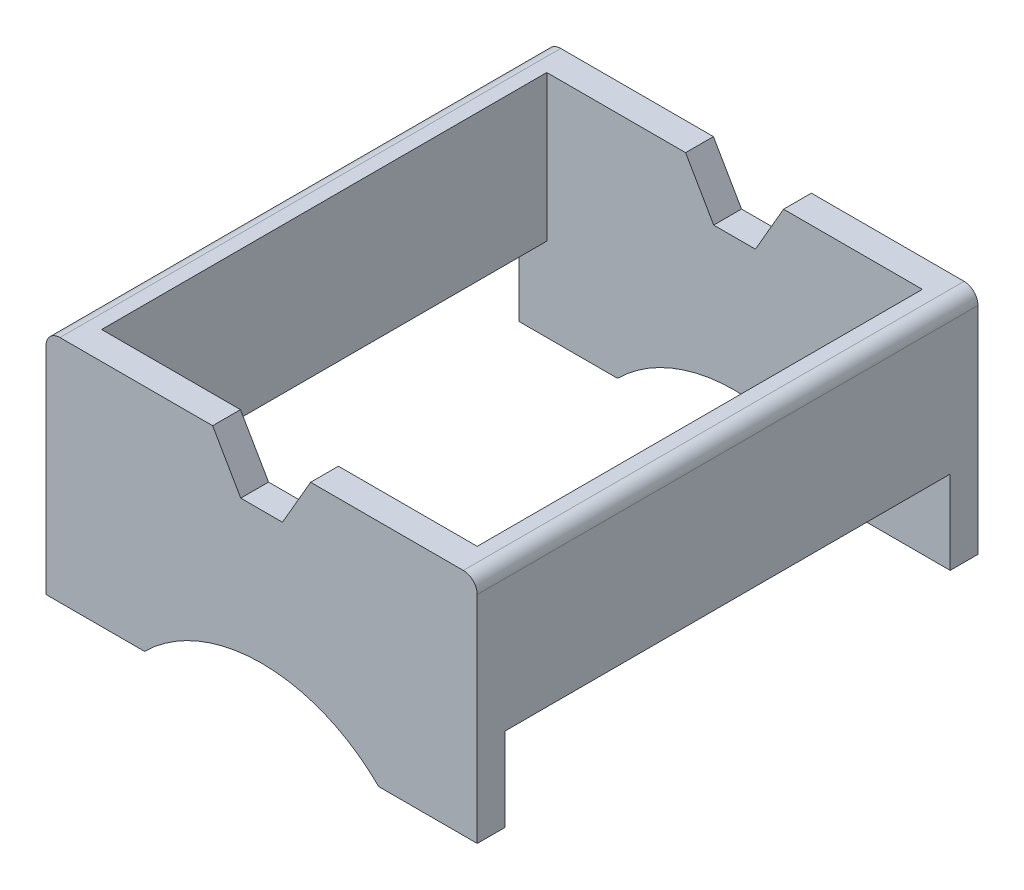
ISO-10303-21;
HEADER;
FILE_DESCRIPTION(('STEP AP214'),'2;1');
FILE_NAME('part.step','',(''),(''),'','','');
FILE_SCHEMA(('AUTOMOTIVE_DESIGN { 1 0 10303 214 1 1 1 1 }'));
ENDSEC;
DATA;
#1=APPLICATION_CONTEXT('core data for automotive mechanical design processes');
#2=APPLICATION_PROTOCOL_DEFINITION('international standard','automotive_design',2000,#1);
#3=PRODUCT_CONTEXT('',#1,'mechanical');
#4=PRODUCT('Part','Part','',(#3));
#5=PRODUCT_RELATED_PRODUCT_CATEGORY('part','',(#4));
#6=PRODUCT_DEFINITION_FORMATION('','',#4);
#7=PRODUCT_DEFINITION_CONTEXT('part definition',#1,'design');
#8=PRODUCT_DEFINITION('design','',#6,#7);
#9=PRODUCT_DEFINITION_SHAPE('','',#8);
#10=(LENGTH_UNIT() NAMED_UNIT(*) SI_UNIT(.MILLI.,.METRE.));
#11=(NAMED_UNIT(*) PLANE_ANGLE_UNIT() SI_UNIT($,.RADIAN.));
#12=(NAMED_UNIT(*) SI_UNIT($,.STERADIAN.) SOLID_ANGLE_UNIT());
#13=UNCERTAINTY_MEASURE_WITH_UNIT(LENGTH_MEASURE(1.E-05),#10,'distance_accuracy_value','');
#14=(GEOMETRIC_REPRESENTATION_CONTEXT(3) GLOBAL_UNCERTAINTY_ASSIGNED_CONTEXT((#13)) GLOBAL_UNIT_ASSIGNED_CONTEXT((#10,
#11,#12)) REPRESENTATION_CONTEXT('',''));
#15=CARTESIAN_POINT('',(0.,0.,0.));
#16=DIRECTION('',(0.,0.,1.));
#17=DIRECTION('',(1.,0.,0.));
#18=AXIS2_PLACEMENT_3D('',#15,#16,#17);
#19=CARTESIAN_POINT('',(-15.5,0.,18.));
#20=DIRECTION('',(0.,1.,0.));
#21=DIRECTION('',(0.,0.,1.));
#22=AXIS2_PLACEMENT_3D('',#19,#20,#21);
#23=PLANE('',#22);
#24=DIRECTION('',(-1.,0.,0.));
#25=VECTOR('',#24,1.);
#26=CARTESIAN_POINT('',(-15.5,0.,-18.));
#27=LINE('',#26,#25);
#28=CARTESIAN_POINT('',(-8.41596001110841,0.,-18.));
#29=VERTEX_POINT('',#28);
#30=CARTESIAN_POINT('',(-15.5,0.,-18.));
#31=VERTEX_POINT('',#30);
#32=EDGE_CURVE('E228',#29,#31,#27,.T.);
#33=ORIENTED_EDGE('',*,*,#32,.F.);
#34=DIRECTION('',(0.,0.,1.));
#35=VECTOR('',#34,1.);
#36=CARTESIAN_POINT('',(-8.41596001110841,0.,-125.864561757798));
#37=LINE('',#36,#35);
#38=CARTESIAN_POINT('',(-8.41596001110841,0.,-16.));
#39=VERTEX_POINT('',#38);
#40=EDGE_CURVE('E227',#29,#39,#37,.T.);
#41=ORIENTED_EDGE('',*,*,#40,.T.);
#42=DIRECTION('',(-1.,0.,0.));
#43=VECTOR('',#42,1.);
#44=CARTESIAN_POINT('',(-13.5,0.,-16.));
#45=LINE('',#44,#43);
#46=CARTESIAN_POINT('',(-15.5,0.,-16.));
#47=VERTEX_POINT('',#46);
#48=EDGE_CURVE('E211',#39,#47,#45,.T.);
#49=ORIENTED_EDGE('',*,*,#48,.T.);
#50=DIRECTION('',(0.,0.,1.));
#51=VECTOR('',#50,1.);
#52=CARTESIAN_POINT('',(-15.5,0.,-18.));
#53=LINE('',#52,#51);
#54=EDGE_CURVE('E340',#31,#47,#53,.T.);
#55=ORIENTED_EDGE('',*,*,#54,.F.);
#56=EDGE_LOOP('',(#33,#41,#49,#55));
#57=FACE_BOUND('',#56,.T.);
#58=ADVANCED_FACE('F37',(#57),#23,.F.);
#59=DIRECTION('',(1.,0.,0.));
#60=VECTOR('',#59,1.);
#61=CARTESIAN_POINT('',(-13.5,0.,16.));
#62=LINE('',#61,#60);
#63=CARTESIAN_POINT('',(-15.5,0.,16.));
#64=VERTEX_POINT('',#63);
#65=CARTESIAN_POINT('',(-8.41596001110841,0.,16.));
#66=VERTEX_POINT('',#65);
#67=EDGE_CURVE('E319',#64,#66,#62,.T.);
#68=ORIENTED_EDGE('',*,*,#67,.T.);
#69=CARTESIAN_POINT('',(-8.41596001110841,0.,18.));
#70=VERTEX_POINT('',#69);
#71=EDGE_CURVE('E60',#66,#70,#37,.T.);
#72=ORIENTED_EDGE('',*,*,#71,.T.);
#73=DIRECTION('',(1.,0.,0.));
#74=VECTOR('',#73,1.);
#75=CARTESIAN_POINT('',(-15.5,0.,18.));
#76=LINE('',#75,#74);
#77=CARTESIAN_POINT('',(-15.5,0.,18.));
#78=VERTEX_POINT('',#77);
#79=EDGE_CURVE('E343',#78,#70,#76,.T.);
#80=ORIENTED_EDGE('',*,*,#79,.F.);
#81=EDGE_CURVE('E332',#64,#78,#53,.T.);
#82=ORIENTED_EDGE('',*,*,#81,.F.);
#83=EDGE_LOOP('',(#68,#72,#80,#82));
#84=FACE_BOUND('',#83,.T.);
#85=ADVANCED_FACE('F490',(#84),#23,.F.);
#86=CARTESIAN_POINT('',(-15.5,16.5,18.));
#87=DIRECTION('',(0.,1.,0.));
#88=DIRECTION('',(0.,0.,1.));
#89=AXIS2_PLACEMENT_3D('',#86,#87,#88);
#90=PLANE('',#89);
#91=DIRECTION('',(1.,0.,0.));
#92=VECTOR('',#91,1.);
#93=CARTESIAN_POINT('',(-15.5,16.5,18.));
#94=LINE('',#93,#92);
#95=CARTESIAN_POINT('',(3.52072594216368,16.5,18.));
#96=VERTEX_POINT('',#95);
#97=CARTESIAN_POINT('',(14.5,16.5,18.));
#98=VERTEX_POINT('',#97);
#99=EDGE_CURVE('E336',#96,#98,#94,.T.);
#100=ORIENTED_EDGE('',*,*,#99,.T.);
#101=DIRECTION('',(0.,0.,-1.));
#102=VECTOR('',#101,1.);
#103=CARTESIAN_POINT('',(14.5,16.5,-18.));
#104=LINE('',#103,#102);
#105=CARTESIAN_POINT('',(14.5,16.5,-18.));
#106=VERTEX_POINT('',#105);
#107=EDGE_CURVE('E370',#98,#106,#104,.T.);
#108=ORIENTED_EDGE('',*,*,#107,.T.);
#109=DIRECTION('',(-1.,0.,0.));
#110=VECTOR('',#109,1.);
#111=CARTESIAN_POINT('',(-15.5,16.5,-18.));
#112=LINE('',#111,#110);
#113=CARTESIAN_POINT('',(3.52072594216368,16.5,-18.));
#114=VERTEX_POINT('',#113);
#115=EDGE_CURVE('E337',#106,#114,#112,.T.);
#116=ORIENTED_EDGE('',*,*,#115,.T.);
#117=DIRECTION('',(0.,0.,-1.));
#118=VECTOR('',#117,1.);
#119=CARTESIAN_POINT('',(3.52072594216368,16.5,18.));
#120=LINE('',#119,#118);
#121=CARTESIAN_POINT('',(3.52072594216368,16.5,-16.));
#122=VERTEX_POINT('',#121);
#123=EDGE_CURVE('E263',#122,#114,#120,.T.);
#124=ORIENTED_EDGE('',*,*,#123,.F.);
#125=DIRECTION('',(-1.,0.,0.));
#126=VECTOR('',#125,1.);
#127=CARTESIAN_POINT('',(-13.5,16.5,-16.));
#128=LINE('',#127,#126);
#129=CARTESIAN_POINT('',(13.5,16.5,-16.));
#130=VERTEX_POINT('',#129);
#131=EDGE_CURVE('E305',#130,#122,#128,.T.);
#132=ORIENTED_EDGE('',*,*,#131,.F.);
#133=DIRECTION('',(0.,0.,-1.));
#134=VECTOR('',#133,1.);
#135=CARTESIAN_POINT('',(13.5,16.5,-16.));
#136=LINE('',#135,#134);
#137=CARTESIAN_POINT('',(13.5,16.5,16.));
#138=VERTEX_POINT('',#137);
#139=EDGE_CURVE('E315',#138,#130,#136,.T.);
#140=ORIENTED_EDGE('',*,*,#139,.F.);
#141=DIRECTION('',(1.,0.,0.));
#142=VECTOR('',#141,1.);
#143=CARTESIAN_POINT('',(-13.5,16.5,16.));
#144=LINE('',#143,#142);
#145=CARTESIAN_POINT('',(3.52072594216368,16.5,16.));
#146=VERTEX_POINT('',#145);
#147=EDGE_CURVE('E311',#146,#138,#144,.T.);
#148=ORIENTED_EDGE('',*,*,#147,.F.);
#149=EDGE_CURVE('E260',#96,#146,#120,.T.);
#150=ORIENTED_EDGE('',*,*,#149,.F.);
#151=EDGE_LOOP('',(#100,#108,#116,#124,#132,#140,#148,#150));
#152=FACE_BOUND('',#151,.T.);
#153=ADVANCED_FACE('F439',(#152),#90,.T.);
#154=CARTESIAN_POINT('',(15.5,0.,-16.));
#155=VERTEX_POINT('',#154);
#156=CARTESIAN_POINT('',(8.41596001110841,0.,-16.));
#157=VERTEX_POINT('',#156);
#158=EDGE_CURVE('E222',#155,#157,#45,.T.);
#159=ORIENTED_EDGE('',*,*,#158,.T.);
#160=DIRECTION('',(0.,0.,1.));
#161=VECTOR('',#160,1.);
#162=CARTESIAN_POINT('',(8.41596001110841,0.,-125.864561757798));
#163=LINE('',#162,#161);
#164=CARTESIAN_POINT('',(8.41596001110841,0.,-18.));
#165=VERTEX_POINT('',#164);
#166=EDGE_CURVE('E234',#165,#157,#163,.T.);
#167=ORIENTED_EDGE('',*,*,#166,.F.);
#168=CARTESIAN_POINT('',(15.5,0.,-18.));
#169=VERTEX_POINT('',#168);
#170=EDGE_CURVE('E349',#169,#165,#27,.T.);
#171=ORIENTED_EDGE('',*,*,#170,.F.);
#172=DIRECTION('',(0.,0.,-1.));
#173=VECTOR('',#172,1.);
#174=CARTESIAN_POINT('',(15.5,0.,-18.));
#175=LINE('',#174,#173);
#176=EDGE_CURVE('E345',#155,#169,#175,.T.);
#177=ORIENTED_EDGE('',*,*,#176,.F.);
#178=EDGE_LOOP('',(#159,#167,#171,#177));
#179=FACE_BOUND('',#178,.T.);
#180=ADVANCED_FACE('F466',(#179),#23,.F.);
#181=CARTESIAN_POINT('',(-3.52072594216368,16.5,-18.));
#182=VERTEX_POINT('',#181);
#183=CARTESIAN_POINT('',(-14.5,16.5,-18.));
#184=VERTEX_POINT('',#183);
#185=EDGE_CURVE('E335',#182,#184,#112,.T.);
#186=ORIENTED_EDGE('',*,*,#185,.T.);
#187=DIRECTION('',(0.,0.,1.));
#188=VECTOR('',#187,1.);
#189=CARTESIAN_POINT('',(-14.5,16.5,18.));
#190=LINE('',#189,#188);
#191=CARTESIAN_POINT('',(-14.5,16.5,18.));
#192=VERTEX_POINT('',#191);
#193=EDGE_CURVE('E383',#184,#192,#190,.T.);
#194=ORIENTED_EDGE('',*,*,#193,.T.);
#195=CARTESIAN_POINT('',(-3.52072594216368,16.5,18.));
#196=VERTEX_POINT('',#195);
#197=EDGE_CURVE('E333',#192,#196,#94,.T.);
#198=ORIENTED_EDGE('',*,*,#197,.T.);
#199=DIRECTION('',(0.,0.,-1.));
#200=VECTOR('',#199,1.);
#201=CARTESIAN_POINT('',(-3.52072594216368,16.5,18.));
#202=LINE('',#201,#200);
#203=CARTESIAN_POINT('',(-3.52072594216368,16.5,16.));
#204=VERTEX_POINT('',#203);
#205=EDGE_CURVE('E264',#196,#204,#202,.T.);
#206=ORIENTED_EDGE('',*,*,#205,.T.);
#207=CARTESIAN_POINT('',(-13.5,16.5,16.));
#208=VERTEX_POINT('',#207);
#209=EDGE_CURVE('E312',#208,#204,#144,.T.);
#210=ORIENTED_EDGE('',*,*,#209,.F.);
#211=DIRECTION('',(0.,0.,1.));
#212=VECTOR('',#211,1.);
#213=CARTESIAN_POINT('',(-13.5,16.5,-16.));
#214=LINE('',#213,#212);
#215=CARTESIAN_POINT('',(-13.5,16.5,-16.));
#216=VERTEX_POINT('',#215);
#217=EDGE_CURVE('E308',#216,#208,#214,.T.);
#218=ORIENTED_EDGE('',*,*,#217,.F.);
#219=CARTESIAN_POINT('',(-3.52072594216368,16.5,-16.));
#220=VERTEX_POINT('',#219);
#221=EDGE_CURVE('E309',#220,#216,#128,.T.);
#222=ORIENTED_EDGE('',*,*,#221,.F.);
#223=EDGE_CURVE('E267',#220,#182,#202,.T.);
#224=ORIENTED_EDGE('',*,*,#223,.T.);
#225=EDGE_LOOP('',(#186,#194,#198,#206,#210,#218,#222,#224));
#226=FACE_BOUND('',#225,.T.);
#227=ADVANCED_FACE('F400',(#226),#90,.T.);
#228=CARTESIAN_POINT('',(8.41596001110841,0.,18.));
#229=VERTEX_POINT('',#228);
#230=CARTESIAN_POINT('',(15.5,0.,18.));
#231=VERTEX_POINT('',#230);
#232=EDGE_CURVE('E342',#229,#231,#76,.T.);
#233=ORIENTED_EDGE('',*,*,#232,.F.);
#234=CARTESIAN_POINT('',(8.41596001110841,0.,15.9999999999999));
#235=VERTEX_POINT('',#234);
#236=EDGE_CURVE('E239',#235,#229,#163,.T.);
#237=ORIENTED_EDGE('',*,*,#236,.F.);
#238=CARTESIAN_POINT('',(15.5,0.,16.));
#239=VERTEX_POINT('',#238);
#240=EDGE_CURVE('E318',#235,#239,#62,.T.);
#241=ORIENTED_EDGE('',*,*,#240,.T.);
#242=EDGE_CURVE('E346',#231,#239,#175,.T.);
#243=ORIENTED_EDGE('',*,*,#242,.F.);
#244=EDGE_LOOP('',(#233,#237,#241,#243));
#245=FACE_BOUND('',#244,.T.);
#246=ADVANCED_FACE('F472',(#245),#23,.F.);
#247=CARTESIAN_POINT('',(-15.5,16.5,-18.));
#248=DIRECTION('',(1.,0.,0.));
#249=DIRECTION('',(0.,0.,-1.));
#250=AXIS2_PLACEMENT_3D('',#247,#248,#249);
#251=PLANE('',#250);
#252=DIRECTION('',(0.,-1.,0.));
#253=VECTOR('',#252,1.);
#254=CARTESIAN_POINT('',(-15.5,16.5,18.));
#255=LINE('',#254,#253);
#256=CARTESIAN_POINT('',(-15.5,15.5,18.));
#257=VERTEX_POINT('',#256);
#258=EDGE_CURVE('E359',#257,#78,#255,.T.);
#259=ORIENTED_EDGE('',*,*,#258,.F.);
#260=DIRECTION('',(0.,0.,1.));
#261=VECTOR('',#260,1.);
#262=CARTESIAN_POINT('',(-15.5,15.5,-18.));
#263=LINE('',#262,#261);
#264=CARTESIAN_POINT('',(-15.5,15.5,-18.));
#265=VERTEX_POINT('',#264);
#266=EDGE_CURVE('E45',#257,#265,#263,.F.);
#267=ORIENTED_EDGE('',*,*,#266,.T.);
#268=DIRECTION('',(0.,-1.,0.));
#269=VECTOR('',#268,1.);
#270=CARTESIAN_POINT('',(-15.5,16.5,-18.));
#271=LINE('',#270,#269);
#272=EDGE_CURVE('E339',#265,#31,#271,.T.);
#273=ORIENTED_EDGE('',*,*,#272,.T.);
#274=ORIENTED_EDGE('',*,*,#54,.T.);
#275=DIRECTION('',(0.,-1.,0.));
#276=VECTOR('',#275,1.);
#277=CARTESIAN_POINT('',(-15.5,6.,-16.));
#278=LINE('',#277,#276);
#279=CARTESIAN_POINT('',(-15.5,6.,-16.));
#280=VERTEX_POINT('',#279);
#281=EDGE_CURVE('E218',#280,#47,#278,.T.);
#282=ORIENTED_EDGE('',*,*,#281,.F.);
#283=DIRECTION('',(0.,0.,-1.));
#284=VECTOR('',#283,1.);
#285=CARTESIAN_POINT('',(-15.5,6.,-16.));
#286=LINE('',#285,#284);
#287=CARTESIAN_POINT('',(-15.5,6.,16.));
#288=VERTEX_POINT('',#287);
#289=EDGE_CURVE('E284',#288,#280,#286,.T.);
#290=ORIENTED_EDGE('',*,*,#289,.F.);
#291=DIRECTION('',(0.,1.,0.));
#292=VECTOR('',#291,1.);
#293=CARTESIAN_POINT('',(-15.5,6.,16.));
#294=LINE('',#293,#292);
#295=EDGE_CURVE('E292',#64,#288,#294,.T.);
#296=ORIENTED_EDGE('',*,*,#295,.F.);
#297=ORIENTED_EDGE('',*,*,#81,.T.);
#298=EDGE_LOOP('',(#259,#267,#273,#274,#282,#290,#296,#297));
#299=FACE_BOUND('',#298,.T.);
#300=ADVANCED_FACE('F389',(#299),#251,.F.);
#301=CARTESIAN_POINT('',(-15.5,16.5,18.));
#302=DIRECTION('',(0.,0.,-1.));
#303=DIRECTION('',(-1.,0.,0.));
#304=AXIS2_PLACEMENT_3D('',#301,#302,#303);
#305=PLANE('',#304);
#306=ORIENTED_EDGE('',*,*,#79,.T.);
#307=CARTESIAN_POINT('',(0.,-8.45720463767051,18.));
#308=DIRECTION('',(0.,0.,-1.));
#309=DIRECTION('',(-1.,0.,0.));
#310=AXIS2_PLACEMENT_3D('',#307,#308,#309);
#311=CIRCLE('',#310,11.9311647877318);
#312=EDGE_CURVE('E52',#70,#229,#311,.T.);
#313=ORIENTED_EDGE('',*,*,#312,.T.);
#314=ORIENTED_EDGE('',*,*,#232,.T.);
#315=DIRECTION('',(0.,-1.,0.));
#316=VECTOR('',#315,1.);
#317=CARTESIAN_POINT('',(15.5,16.5,18.));
#318=LINE('',#317,#316);
#319=CARTESIAN_POINT('',(15.5,15.5,18.));
#320=VERTEX_POINT('',#319);
#321=EDGE_CURVE('E356',#320,#231,#318,.T.);
#322=ORIENTED_EDGE('',*,*,#321,.F.);
#323=CARTESIAN_POINT('',(14.5,15.5,18.));
#324=DIRECTION('',(0.,0.,-1.));
#325=DIRECTION('',(-1.,0.,0.));
#326=AXIS2_PLACEMENT_3D('',#323,#324,#325);
#327=CIRCLE('',#326,1.);
#328=EDGE_CURVE('E381',#320,#98,#327,.F.);
#329=ORIENTED_EDGE('',*,*,#328,.T.);
#330=ORIENTED_EDGE('',*,*,#99,.F.);
#331=DIRECTION('',(-0.499999999999997,-0.86602540378444,0.));
#332=VECTOR('',#331,1.);
#333=CARTESIAN_POINT('',(3.52072594216368,16.5,18.));
#334=LINE('',#333,#332);
#335=CARTESIAN_POINT('',(1.5,13.,18.));
#336=VERTEX_POINT('',#335);
#337=EDGE_CURVE('E243',#96,#336,#334,.T.);
#338=ORIENTED_EDGE('',*,*,#337,.T.);
#339=DIRECTION('',(-1.,0.,0.));
#340=VECTOR('',#339,1.);
#341=CARTESIAN_POINT('',(-1.5,13.,18.));
#342=LINE('',#341,#340);
#343=CARTESIAN_POINT('',(-1.5,13.,18.));
#344=VERTEX_POINT('',#343);
#345=EDGE_CURVE('E246',#336,#344,#342,.T.);
#346=ORIENTED_EDGE('',*,*,#345,.T.);
#347=DIRECTION('',(-0.499999999999997,0.86602540378444,0.));
#348=VECTOR('',#347,1.);
#349=CARTESIAN_POINT('',(-3.52072594216368,16.5,18.));
#350=LINE('',#349,#348);
#351=EDGE_CURVE('E250',#344,#196,#350,.T.);
#352=ORIENTED_EDGE('',*,*,#351,.T.);
#353=ORIENTED_EDGE('',*,*,#197,.F.);
#354=CARTESIAN_POINT('',(-14.5,15.5,18.));
#355=DIRECTION('',(0.,0.,-1.));
#356=DIRECTION('',(-1.,0.,0.));
#357=AXIS2_PLACEMENT_3D('',#354,#355,#356);
#358=CIRCLE('',#357,1.);
#359=EDGE_CURVE('E379',#192,#257,#358,.F.);
#360=ORIENTED_EDGE('',*,*,#359,.T.);
#361=ORIENTED_EDGE('',*,*,#258,.T.);
#362=EDGE_LOOP('',(#306,#313,#314,#322,#329,#330,#338,#346,#352,#353,#360,#361));
#363=FACE_BOUND('',#362,.T.);
#364=ADVANCED_FACE('F403',(#363),#305,.F.);
#365=CARTESIAN_POINT('',(15.5,16.5,-18.));
#366=DIRECTION('',(-1.,0.,0.));
#367=DIRECTION('',(0.,0.,1.));
#368=AXIS2_PLACEMENT_3D('',#365,#366,#367);
#369=PLANE('',#368);
#370=DIRECTION('',(0.,-1.,0.));
#371=VECTOR('',#370,1.);
#372=CARTESIAN_POINT('',(15.5,16.5,-18.));
#373=LINE('',#372,#371);
#374=CARTESIAN_POINT('',(15.5,15.5,-18.));
#375=VERTEX_POINT('',#374);
#376=EDGE_CURVE('E354',#375,#169,#373,.T.);
#377=ORIENTED_EDGE('',*,*,#376,.F.);
#378=DIRECTION('',(0.,0.,-1.));
#379=VECTOR('',#378,1.);
#380=CARTESIAN_POINT('',(15.5,15.5,18.));
#381=LINE('',#380,#379);
#382=EDGE_CURVE('E377',#375,#320,#381,.F.);
#383=ORIENTED_EDGE('',*,*,#382,.T.);
#384=ORIENTED_EDGE('',*,*,#321,.T.);
#385=ORIENTED_EDGE('',*,*,#242,.T.);
#386=DIRECTION('',(0.,1.,0.));
#387=VECTOR('',#386,1.);
#388=CARTESIAN_POINT('',(15.5,6.,16.));
#389=LINE('',#388,#387);
#390=CARTESIAN_POINT('',(15.5,6.,16.));
#391=VERTEX_POINT('',#390);
#392=EDGE_CURVE('E283',#239,#391,#389,.T.);
#393=ORIENTED_EDGE('',*,*,#392,.T.);
#394=DIRECTION('',(0.,0.,-1.));
#395=VECTOR('',#394,1.);
#396=CARTESIAN_POINT('',(15.5,6.,-16.));
#397=LINE('',#396,#395);
#398=CARTESIAN_POINT('',(15.5,6.,-16.));
#399=VERTEX_POINT('',#398);
#400=EDGE_CURVE('E287',#391,#399,#397,.T.);
#401=ORIENTED_EDGE('',*,*,#400,.T.);
#402=DIRECTION('',(0.,-1.,0.));
#403=VECTOR('',#402,1.);
#404=CARTESIAN_POINT('',(15.5,6.,-16.));
#405=LINE('',#404,#403);
#406=EDGE_CURVE('E280',#399,#155,#405,.T.);
#407=ORIENTED_EDGE('',*,*,#406,.T.);
#408=ORIENTED_EDGE('',*,*,#176,.T.);
#409=EDGE_LOOP('',(#377,#383,#384,#385,#393,#401,#407,#408));
#410=FACE_BOUND('',#409,.T.);
#411=ADVANCED_FACE('F462',(#410),#369,.F.);
#412=CARTESIAN_POINT('',(-15.5,16.5,-18.));
#413=DIRECTION('',(0.,0.,1.));
#414=DIRECTION('',(1.,0.,0.));
#415=AXIS2_PLACEMENT_3D('',#412,#413,#414);
#416=PLANE('',#415);
#417=ORIENTED_EDGE('',*,*,#170,.T.);
#418=CARTESIAN_POINT('',(0.,-8.45720463767051,-18.));
#419=DIRECTION('',(0.,0.,1.));
#420=DIRECTION('',(1.,0.,0.));
#421=AXIS2_PLACEMENT_3D('',#418,#419,#420);
#422=CIRCLE('',#421,11.9311647877318);
#423=EDGE_CURVE('E235',#165,#29,#422,.T.);
#424=ORIENTED_EDGE('',*,*,#423,.T.);
#425=ORIENTED_EDGE('',*,*,#32,.T.);
#426=ORIENTED_EDGE('',*,*,#272,.F.);
#427=CARTESIAN_POINT('',(-14.5,15.5,-18.));
#428=DIRECTION('',(0.,0.,1.));
#429=DIRECTION('',(1.,0.,0.));
#430=AXIS2_PLACEMENT_3D('',#427,#428,#429);
#431=CIRCLE('',#430,1.);
#432=EDGE_CURVE('E373',#265,#184,#431,.F.);
#433=ORIENTED_EDGE('',*,*,#432,.T.);
#434=ORIENTED_EDGE('',*,*,#185,.F.);
#435=DIRECTION('',(-0.499999999999997,0.86602540378444,0.));
#436=VECTOR('',#435,1.);
#437=CARTESIAN_POINT('',(-3.52072594216368,16.5,-18.));
#438=LINE('',#437,#436);
#439=CARTESIAN_POINT('',(-1.5,13.,-18.));
#440=VERTEX_POINT('',#439);
#441=EDGE_CURVE('E247',#440,#182,#438,.T.);
#442=ORIENTED_EDGE('',*,*,#441,.F.);
#443=DIRECTION('',(-1.,0.,0.));
#444=VECTOR('',#443,1.);
#445=CARTESIAN_POINT('',(-1.5,13.,-18.));
#446=LINE('',#445,#444);
#447=CARTESIAN_POINT('',(1.5,13.,-18.));
#448=VERTEX_POINT('',#447);
#449=EDGE_CURVE('E256',#448,#440,#446,.T.);
#450=ORIENTED_EDGE('',*,*,#449,.F.);
#451=DIRECTION('',(-0.499999999999997,-0.86602540378444,0.));
#452=VECTOR('',#451,1.);
#453=CARTESIAN_POINT('',(3.52072594216368,16.5,-18.));
#454=LINE('',#453,#452);
#455=EDGE_CURVE('E242',#114,#448,#454,.T.);
#456=ORIENTED_EDGE('',*,*,#455,.F.);
#457=ORIENTED_EDGE('',*,*,#115,.F.);
#458=CARTESIAN_POINT('',(14.5,15.5,-18.));
#459=DIRECTION('',(0.,0.,1.));
#460=DIRECTION('',(1.,0.,0.));
#461=AXIS2_PLACEMENT_3D('',#458,#459,#460);
#462=CIRCLE('',#461,1.);
#463=EDGE_CURVE('E375',#106,#375,#462,.F.);
#464=ORIENTED_EDGE('',*,*,#463,.T.);
#465=ORIENTED_EDGE('',*,*,#376,.T.);
#466=EDGE_LOOP('',(#417,#424,#425,#426,#433,#434,#442,#450,#456,#457,#464,#465));
#467=FACE_BOUND('',#466,.T.);
#468=ADVANCED_FACE('F394',(#467),#416,.F.);
#469=CARTESIAN_POINT('',(-13.5,16.5,-16.));
#470=DIRECTION('',(0.,0.,1.));
#471=DIRECTION('',(1.,0.,0.));
#472=AXIS2_PLACEMENT_3D('',#469,#470,#471);
#473=PLANE('',#472);
#474=CARTESIAN_POINT('',(0.,-8.45720463767051,-16.));
#475=DIRECTION('',(0.,0.,1.));
#476=DIRECTION('',(1.,0.,0.));
#477=AXIS2_PLACEMENT_3D('',#474,#475,#476);
#478=CIRCLE('',#477,11.9311647877318);
#479=EDGE_CURVE('E215',#157,#39,#478,.T.);
#480=ORIENTED_EDGE('',*,*,#479,.F.);
#481=ORIENTED_EDGE('',*,*,#158,.F.);
#482=ORIENTED_EDGE('',*,*,#406,.F.);
#483=DIRECTION('',(-1.,0.,0.));
#484=VECTOR('',#483,1.);
#485=CARTESIAN_POINT('',(15.5,6.,-16.));
#486=LINE('',#485,#484);
#487=CARTESIAN_POINT('',(13.5,6.,-16.));
#488=VERTEX_POINT('',#487);
#489=EDGE_CURVE('E297',#399,#488,#486,.T.);
#490=ORIENTED_EDGE('',*,*,#489,.T.);
#491=DIRECTION('',(0.,-1.,0.));
#492=VECTOR('',#491,1.);
#493=CARTESIAN_POINT('',(13.5,16.5,-16.));
#494=LINE('',#493,#492);
#495=EDGE_CURVE('E316',#130,#488,#494,.T.);
#496=ORIENTED_EDGE('',*,*,#495,.F.);
#497=ORIENTED_EDGE('',*,*,#131,.T.);
#498=DIRECTION('',(0.499999999999997,0.86602540378444,0.));
#499=VECTOR('',#498,1.);
#500=CARTESIAN_POINT('',(-0.734455543377198,9.12980947161674,-16.));
#501=LINE('',#500,#499);
#502=CARTESIAN_POINT('',(1.5,13.,-16.));
#503=VERTEX_POINT('',#502);
#504=EDGE_CURVE('E278',#503,#122,#501,.T.);
#505=ORIENTED_EDGE('',*,*,#504,.F.);
#506=DIRECTION('',(1.,0.,0.));
#507=VECTOR('',#506,1.);
#508=CARTESIAN_POINT('',(-13.5,13.,-16.));
#509=LINE('',#508,#507);
#510=CARTESIAN_POINT('',(-1.5,13.,-16.));
#511=VERTEX_POINT('',#510);
#512=EDGE_CURVE('E262',#511,#503,#509,.T.);
#513=ORIENTED_EDGE('',*,*,#512,.F.);
#514=DIRECTION('',(0.499999999999997,-0.86602540378444,0.));
#515=VECTOR('',#514,1.);
#516=CARTESIAN_POINT('',(-6.01554445662273,20.8211524227066,-16.));
#517=LINE('',#516,#515);
#518=EDGE_CURVE('E275',#220,#511,#517,.T.);
#519=ORIENTED_EDGE('',*,*,#518,.F.);
#520=ORIENTED_EDGE('',*,*,#221,.T.);
#521=DIRECTION('',(0.,-1.,0.));
#522=VECTOR('',#521,1.);
#523=CARTESIAN_POINT('',(-13.5,16.5,-16.));
#524=LINE('',#523,#522);
#525=CARTESIAN_POINT('',(-13.5,6.,-16.));
#526=VERTEX_POINT('',#525);
#527=EDGE_CURVE('E329',#216,#526,#524,.T.);
#528=ORIENTED_EDGE('',*,*,#527,.T.);
#529=EDGE_CURVE('E300',#526,#280,#486,.T.);
#530=ORIENTED_EDGE('',*,*,#529,.T.);
#531=ORIENTED_EDGE('',*,*,#281,.T.);
#532=ORIENTED_EDGE('',*,*,#48,.F.);
#533=EDGE_LOOP('',(#480,#481,#482,#490,#496,#497,#505,#513,#519,#520,#528,#530,#531,#532));
#534=FACE_BOUND('',#533,.T.);
#535=ADVANCED_FACE('F213',(#534),#473,.T.);
#536=CARTESIAN_POINT('',(-13.5,16.5,-16.));
#537=DIRECTION('',(1.,0.,0.));
#538=DIRECTION('',(0.,0.,-1.));
#539=AXIS2_PLACEMENT_3D('',#536,#537,#538);
#540=PLANE('',#539);
#541=DIRECTION('',(0.,0.,1.));
#542=VECTOR('',#541,1.);
#543=CARTESIAN_POINT('',(-13.5,6.,-16.));
#544=LINE('',#543,#542);
#545=CARTESIAN_POINT('',(-13.5,6.,16.));
#546=VERTEX_POINT('',#545);
#547=EDGE_CURVE('E223',#526,#546,#544,.T.);
#548=ORIENTED_EDGE('',*,*,#547,.F.);
#549=ORIENTED_EDGE('',*,*,#527,.F.);
#550=ORIENTED_EDGE('',*,*,#217,.T.);
#551=DIRECTION('',(0.,-1.,0.));
#552=VECTOR('',#551,1.);
#553=CARTESIAN_POINT('',(-13.5,16.5,16.));
#554=LINE('',#553,#552);
#555=EDGE_CURVE('E326',#208,#546,#554,.T.);
#556=ORIENTED_EDGE('',*,*,#555,.T.);
#557=EDGE_LOOP('',(#548,#549,#550,#556));
#558=FACE_BOUND('',#557,.T.);
#559=ADVANCED_FACE('F417',(#558),#540,.T.);
#560=CARTESIAN_POINT('',(-13.5,16.5,16.));
#561=DIRECTION('',(0.,0.,-1.));
#562=DIRECTION('',(-1.,0.,0.));
#563=AXIS2_PLACEMENT_3D('',#560,#561,#562);
#564=PLANE('',#563);
#565=CARTESIAN_POINT('',(0.,-8.45720463767051,16.));
#566=DIRECTION('',(0.,0.,-1.));
#567=DIRECTION('',(-1.,0.,0.));
#568=AXIS2_PLACEMENT_3D('',#565,#566,#567);
#569=CIRCLE('',#568,11.9311647877318);
#570=EDGE_CURVE('E11',#66,#235,#569,.T.);
#571=ORIENTED_EDGE('',*,*,#570,.F.);
#572=ORIENTED_EDGE('',*,*,#67,.F.);
#573=ORIENTED_EDGE('',*,*,#295,.T.);
#574=DIRECTION('',(-1.,0.,0.));
#575=VECTOR('',#574,1.);
#576=CARTESIAN_POINT('',(15.5,6.,16.));
#577=LINE('',#576,#575);
#578=EDGE_CURVE('E290',#546,#288,#577,.T.);
#579=ORIENTED_EDGE('',*,*,#578,.F.);
#580=ORIENTED_EDGE('',*,*,#555,.F.);
#581=ORIENTED_EDGE('',*,*,#209,.T.);
#582=DIRECTION('',(-0.499999999999997,0.86602540378444,0.));
#583=VECTOR('',#582,1.);
#584=CARTESIAN_POINT('',(-6.01554445662273,20.8211524227066,16.));
#585=LINE('',#584,#583);
#586=CARTESIAN_POINT('',(-1.5,13.,16.));
#587=VERTEX_POINT('',#586);
#588=EDGE_CURVE('E365',#587,#204,#585,.T.);
#589=ORIENTED_EDGE('',*,*,#588,.F.);
#590=DIRECTION('',(-1.,0.,0.));
#591=VECTOR('',#590,1.);
#592=CARTESIAN_POINT('',(-13.5,13.,16.));
#593=LINE('',#592,#591);
#594=CARTESIAN_POINT('',(1.5,13.,16.));
#595=VERTEX_POINT('',#594);
#596=EDGE_CURVE('E363',#595,#587,#593,.T.);
#597=ORIENTED_EDGE('',*,*,#596,.F.);
#598=DIRECTION('',(-0.499999999999997,-0.86602540378444,0.));
#599=VECTOR('',#598,1.);
#600=CARTESIAN_POINT('',(-0.734455543377196,9.12980947161674,16.));
#601=LINE('',#600,#599);
#602=EDGE_CURVE('E367',#146,#595,#601,.T.);
#603=ORIENTED_EDGE('',*,*,#602,.F.);
#604=ORIENTED_EDGE('',*,*,#147,.T.);
#605=DIRECTION('',(0.,-1.,0.));
#606=VECTOR('',#605,1.);
#607=CARTESIAN_POINT('',(13.5,16.5,16.));
#608=LINE('',#607,#606);
#609=CARTESIAN_POINT('',(13.5,6.,16.));
#610=VERTEX_POINT('',#609);
#611=EDGE_CURVE('E323',#138,#610,#608,.T.);
#612=ORIENTED_EDGE('',*,*,#611,.T.);
#613=EDGE_CURVE('E301',#391,#610,#577,.T.);
#614=ORIENTED_EDGE('',*,*,#613,.F.);
#615=ORIENTED_EDGE('',*,*,#392,.F.);
#616=ORIENTED_EDGE('',*,*,#240,.F.);
#617=EDGE_LOOP('',(#571,#572,#573,#579,#580,#581,#589,#597,#603,#604,#612,#614,#615,#616));
#618=FACE_BOUND('',#617,.T.);
#619=ADVANCED_FACE('F413',(#618),#564,.T.);
#620=CARTESIAN_POINT('',(13.5,16.5,-16.));
#621=DIRECTION('',(-1.,0.,0.));
#622=DIRECTION('',(0.,0.,1.));
#623=AXIS2_PLACEMENT_3D('',#620,#621,#622);
#624=PLANE('',#623);
#625=DIRECTION('',(0.,0.,-1.));
#626=VECTOR('',#625,1.);
#627=CARTESIAN_POINT('',(13.5,6.,-16.));
#628=LINE('',#627,#626);
#629=EDGE_CURVE('E361',#610,#488,#628,.T.);
#630=ORIENTED_EDGE('',*,*,#629,.F.);
#631=ORIENTED_EDGE('',*,*,#611,.F.);
#632=ORIENTED_EDGE('',*,*,#139,.T.);
#633=ORIENTED_EDGE('',*,*,#495,.T.);
#634=EDGE_LOOP('',(#630,#631,#632,#633));
#635=FACE_BOUND('',#634,.T.);
#636=ADVANCED_FACE('F445',(#635),#624,.T.);
#637=CARTESIAN_POINT('',(15.5,6.,-16.));
#638=DIRECTION('',(0.,1.,0.));
#639=DIRECTION('',(0.,0.,1.));
#640=AXIS2_PLACEMENT_3D('',#637,#638,#639);
#641=PLANE('',#640);
#642=ORIENTED_EDGE('',*,*,#629,.T.);
#643=ORIENTED_EDGE('',*,*,#489,.F.);
#644=ORIENTED_EDGE('',*,*,#400,.F.);
#645=ORIENTED_EDGE('',*,*,#613,.T.);
#646=EDGE_LOOP('',(#642,#643,#644,#645));
#647=FACE_BOUND('',#646,.T.);
#648=ADVANCED_FACE('F477',(#647),#641,.F.);
#649=ORIENTED_EDGE('',*,*,#547,.T.);
#650=ORIENTED_EDGE('',*,*,#578,.T.);
#651=ORIENTED_EDGE('',*,*,#289,.T.);
#652=ORIENTED_EDGE('',*,*,#529,.F.);
#653=EDGE_LOOP('',(#649,#650,#651,#652));
#654=FACE_BOUND('',#653,.T.);
#655=ADVANCED_FACE('F479',(#654),#641,.F.);
#656=CARTESIAN_POINT('',(-1.5,13.,18.));
#657=DIRECTION('',(0.,-1.,0.));
#658=DIRECTION('',(0.,0.,-1.));
#659=AXIS2_PLACEMENT_3D('',#656,#657,#658);
#660=PLANE('',#659);
#661=ORIENTED_EDGE('',*,*,#596,.T.);
#662=DIRECTION('',(0.,0.,-1.));
#663=VECTOR('',#662,1.);
#664=CARTESIAN_POINT('',(-1.5,13.,18.));
#665=LINE('',#664,#663);
#666=EDGE_CURVE('E268',#344,#587,#665,.T.);
#667=ORIENTED_EDGE('',*,*,#666,.F.);
#668=ORIENTED_EDGE('',*,*,#345,.F.);
#669=DIRECTION('',(0.,0.,-1.));
#670=VECTOR('',#669,1.);
#671=CARTESIAN_POINT('',(1.5,13.,18.));
#672=LINE('',#671,#670);
#673=EDGE_CURVE('E272',#336,#595,#672,.T.);
#674=ORIENTED_EDGE('',*,*,#673,.T.);
#675=EDGE_LOOP('',(#661,#667,#668,#674));
#676=FACE_BOUND('',#675,.T.);
#677=ADVANCED_FACE('F485',(#676),#660,.F.);
#678=CARTESIAN_POINT('',(-3.52072594216368,16.5,18.));
#679=DIRECTION('',(-0.86602540378444,-0.499999999999997,0.));
#680=DIRECTION('',(0.499999999999997,-0.86602540378444,0.));
#681=AXIS2_PLACEMENT_3D('',#678,#679,#680);
#682=PLANE('',#681);
#683=ORIENTED_EDGE('',*,*,#588,.T.);
#684=ORIENTED_EDGE('',*,*,#205,.F.);
#685=ORIENTED_EDGE('',*,*,#351,.F.);
#686=ORIENTED_EDGE('',*,*,#666,.T.);
#687=EDGE_LOOP('',(#683,#684,#685,#686));
#688=FACE_BOUND('',#687,.T.);
#689=ADVANCED_FACE('F407',(#688),#682,.F.);
#690=CARTESIAN_POINT('',(3.52072594216368,16.5,18.));
#691=DIRECTION('',(0.86602540378444,-0.499999999999997,0.));
#692=DIRECTION('',(0.499999999999997,0.86602540378444,0.));
#693=AXIS2_PLACEMENT_3D('',#690,#691,#692);
#694=PLANE('',#693);
#695=ORIENTED_EDGE('',*,*,#602,.T.);
#696=ORIENTED_EDGE('',*,*,#673,.F.);
#697=ORIENTED_EDGE('',*,*,#337,.F.);
#698=ORIENTED_EDGE('',*,*,#149,.T.);
#699=EDGE_LOOP('',(#695,#696,#697,#698));
#700=FACE_BOUND('',#699,.T.);
#701=ADVANCED_FACE('F452',(#700),#694,.F.);
#702=ORIENTED_EDGE('',*,*,#504,.T.);
#703=ORIENTED_EDGE('',*,*,#123,.T.);
#704=ORIENTED_EDGE('',*,*,#455,.T.);
#705=EDGE_CURVE('E253',#503,#448,#672,.T.);
#706=ORIENTED_EDGE('',*,*,#705,.F.);
#707=EDGE_LOOP('',(#702,#703,#704,#706));
#708=FACE_BOUND('',#707,.T.);
#709=ADVANCED_FACE('F434',(#708),#694,.F.);
#710=ORIENTED_EDGE('',*,*,#518,.T.);
#711=EDGE_CURVE('E271',#511,#440,#665,.T.);
#712=ORIENTED_EDGE('',*,*,#711,.T.);
#713=ORIENTED_EDGE('',*,*,#441,.T.);
#714=ORIENTED_EDGE('',*,*,#223,.F.);
#715=EDGE_LOOP('',(#710,#712,#713,#714));
#716=FACE_BOUND('',#715,.T.);
#717=ADVANCED_FACE('F424',(#716),#682,.F.);
#718=ORIENTED_EDGE('',*,*,#512,.T.);
#719=ORIENTED_EDGE('',*,*,#705,.T.);
#720=ORIENTED_EDGE('',*,*,#449,.T.);
#721=ORIENTED_EDGE('',*,*,#711,.F.);
#722=EDGE_LOOP('',(#718,#719,#720,#721));
#723=FACE_BOUND('',#722,.T.);
#724=ADVANCED_FACE('F430',(#723),#660,.F.);
#725=CARTESIAN_POINT('',(14.5,15.5,18.));
#726=DIRECTION('',(0.,0.,1.));
#727=DIRECTION('',(1.,0.,0.));
#728=AXIS2_PLACEMENT_3D('',#725,#726,#727);
#729=CYLINDRICAL_SURFACE('',#728,1.);
#730=ORIENTED_EDGE('',*,*,#328,.F.);
#731=ORIENTED_EDGE('',*,*,#382,.F.);
#732=ORIENTED_EDGE('',*,*,#463,.F.);
#733=ORIENTED_EDGE('',*,*,#107,.F.);
#734=EDGE_LOOP('',(#730,#731,#732,#733));
#735=FACE_BOUND('',#734,.T.);
#736=ADVANCED_FACE('F457',(#735),#729,.T.);
#737=CARTESIAN_POINT('',(-14.5,15.5,18.));
#738=DIRECTION('',(0.,0.,-1.));
#739=DIRECTION('',(-1.,0.,0.));
#740=AXIS2_PLACEMENT_3D('',#737,#738,#739);
#741=CYLINDRICAL_SURFACE('',#740,1.);
#742=ORIENTED_EDGE('',*,*,#432,.F.);
#743=ORIENTED_EDGE('',*,*,#266,.F.);
#744=ORIENTED_EDGE('',*,*,#359,.F.);
#745=ORIENTED_EDGE('',*,*,#193,.F.);
#746=EDGE_LOOP('',(#742,#743,#744,#745));
#747=FACE_BOUND('',#746,.T.);
#748=ADVANCED_FACE('F39',(#747),#741,.T.);
#749=CARTESIAN_POINT('',(0.,-8.45720463767051,-125.864561757798));
#750=DIRECTION('',(0.,0.,1.));
#751=DIRECTION('',(1.,0.,0.));
#752=AXIS2_PLACEMENT_3D('',#749,#750,#751);
#753=CYLINDRICAL_SURFACE('',#752,11.9311647877318);
#754=ORIENTED_EDGE('',*,*,#312,.F.);
#755=ORIENTED_EDGE('',*,*,#71,.F.);
#756=ORIENTED_EDGE('',*,*,#570,.T.);
#757=ORIENTED_EDGE('',*,*,#236,.T.);
#758=EDGE_LOOP('',(#754,#755,#756,#757));
#759=FACE_BOUND('',#758,.T.);
#760=ADVANCED_FACE('F470',(#759),#753,.F.);
#761=ORIENTED_EDGE('',*,*,#423,.F.);
#762=ORIENTED_EDGE('',*,*,#166,.T.);
#763=ORIENTED_EDGE('',*,*,#479,.T.);
#764=ORIENTED_EDGE('',*,*,#40,.F.);
#765=EDGE_LOOP('',(#761,#762,#763,#764));
#766=FACE_BOUND('',#765,.T.);
#767=ADVANCED_FACE('F233',(#766),#753,.F.);
#768=CLOSED_SHELL('',(#58,#85,#153,#180,#227,#246,#300,#364,#411,#468,#535,#559,#619,#636,#648,
#655,#677,#689,#701,#709,#717,#724,#736,#748,#760,#767));
#769=MANIFOLD_SOLID_BREP('B2',#768);
#770=ADVANCED_BREP_SHAPE_REPRESENTATION('',(#18,#769),#14);
#771=SHAPE_DEFINITION_REPRESENTATION(#9,#770);
ENDSEC;
END-ISO-10303-21;
